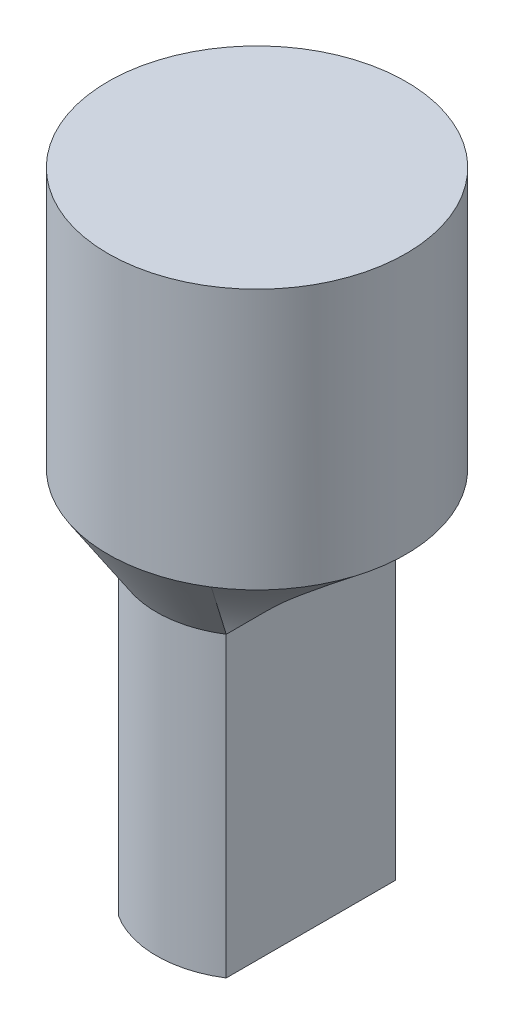
ISO-10303-21;
HEADER;
FILE_DESCRIPTION(('STEP AP214'),'2;1');
FILE_NAME('part.step','',(''),(''),'','','');
FILE_SCHEMA(('AUTOMOTIVE_DESIGN { 1 0 10303 214 1 1 1 1 }'));
ENDSEC;
DATA;
#1=APPLICATION_CONTEXT('core data for automotive mechanical design processes');
#2=APPLICATION_PROTOCOL_DEFINITION('international standard','automotive_design',2000,#1);
#3=PRODUCT_CONTEXT('',#1,'mechanical');
#4=PRODUCT('Part','Part','',(#3));
#5=PRODUCT_RELATED_PRODUCT_CATEGORY('part','',(#4));
#6=PRODUCT_DEFINITION_FORMATION('','',#4);
#7=PRODUCT_DEFINITION_CONTEXT('part definition',#1,'design');
#8=PRODUCT_DEFINITION('design','',#6,#7);
#9=PRODUCT_DEFINITION_SHAPE('','',#8);
#10=(LENGTH_UNIT() NAMED_UNIT(*) SI_UNIT(.MILLI.,.METRE.));
#11=(NAMED_UNIT(*) PLANE_ANGLE_UNIT() SI_UNIT($,.RADIAN.));
#12=(NAMED_UNIT(*) SI_UNIT($,.STERADIAN.) SOLID_ANGLE_UNIT());
#13=UNCERTAINTY_MEASURE_WITH_UNIT(LENGTH_MEASURE(1.E-05),#10,'distance_accuracy_value','');
#14=(GEOMETRIC_REPRESENTATION_CONTEXT(3) GLOBAL_UNCERTAINTY_ASSIGNED_CONTEXT((#13)) GLOBAL_UNIT_ASSIGNED_CONTEXT((#10,
#11,#12)) REPRESENTATION_CONTEXT('',''));
#15=CARTESIAN_POINT('',(0.,0.,0.));
#16=DIRECTION('',(0.,0.,1.));
#17=DIRECTION('',(1.,0.,0.));
#18=AXIS2_PLACEMENT_3D('',#15,#16,#17);
#19=CARTESIAN_POINT('',(0.,8.,0.));
#20=DIRECTION('',(0.,-1.,0.));
#21=DIRECTION('',(0.,0.,-1.));
#22=AXIS2_PLACEMENT_3D('',#19,#20,#21);
#23=CYLINDRICAL_SURFACE('',#22,2.7);
#24=CARTESIAN_POINT('',(0.,0.,0.));
#25=DIRECTION('',(0.,1.,0.));
#26=DIRECTION('',(0.,0.,1.));
#27=AXIS2_PLACEMENT_3D('',#24,#25,#26);
#28=CIRCLE('',#27,2.7);
#29=CARTESIAN_POINT('',(1.45,0.,-2.27760839478607));
#30=VERTEX_POINT('',#29);
#31=CARTESIAN_POINT('',(-1.45,0.,-2.27760839478607));
#32=VERTEX_POINT('',#31);
#33=EDGE_CURVE('E249',#30,#32,#28,.T.);
#34=ORIENTED_EDGE('',*,*,#33,.T.);
#35=DIRECTION('',(0.,-1.,0.));
#36=VECTOR('',#35,1.);
#37=CARTESIAN_POINT('',(-1.45,8.,-2.27760839478607));
#38=LINE('',#37,#36);
#39=CARTESIAN_POINT('',(-1.45,8.,-2.27760839478607));
#40=VERTEX_POINT('',#39);
#41=EDGE_CURVE('E12',#40,#32,#38,.T.);
#42=ORIENTED_EDGE('',*,*,#41,.F.);
#43=CARTESIAN_POINT('',(0.,8.,0.));
#44=DIRECTION('',(0.,1.,0.));
#45=DIRECTION('',(0.,0.,1.));
#46=AXIS2_PLACEMENT_3D('',#43,#44,#45);
#47=CIRCLE('',#46,2.7);
#48=CARTESIAN_POINT('',(1.45,8.,-2.27760839478607));
#49=VERTEX_POINT('',#48);
#50=EDGE_CURVE('E219',#49,#40,#47,.T.);
#51=ORIENTED_EDGE('',*,*,#50,.F.);
#52=DIRECTION('',(0.,-1.,0.));
#53=VECTOR('',#52,1.);
#54=CARTESIAN_POINT('',(1.45,8.,-2.27760839478607));
#55=LINE('',#54,#53);
#56=EDGE_CURVE('E91',#49,#30,#55,.T.);
#57=ORIENTED_EDGE('',*,*,#56,.T.);
#58=EDGE_LOOP('',(#34,#42,#51,#57));
#59=FACE_BOUND('',#58,.T.);
#60=ADVANCED_FACE('F71',(#59),#23,.T.);
#61=CARTESIAN_POINT('',(-1.45,8.,2.27760839478607));
#62=DIRECTION('',(1.,0.,0.));
#63=DIRECTION('',(0.,0.,-1.));
#64=AXIS2_PLACEMENT_3D('',#61,#62,#63);
#65=PLANE('',#64);
#66=DIRECTION('',(0.,0.,1.));
#67=VECTOR('',#66,1.);
#68=CARTESIAN_POINT('',(-1.45,0.,2.27760839478607));
#69=LINE('',#68,#67);
#70=CARTESIAN_POINT('',(-1.45,0.,2.27760839478607));
#71=VERTEX_POINT('',#70);
#72=EDGE_CURVE('E246',#32,#71,#69,.T.);
#73=ORIENTED_EDGE('',*,*,#72,.T.);
#74=DIRECTION('',(0.,-1.,0.));
#75=VECTOR('',#74,1.);
#76=CARTESIAN_POINT('',(-1.45,8.,2.27760839478607));
#77=LINE('',#76,#75);
#78=CARTESIAN_POINT('',(-1.45,8.,2.27760839478607));
#79=VERTEX_POINT('',#78);
#80=EDGE_CURVE('E82',#79,#71,#77,.T.);
#81=ORIENTED_EDGE('',*,*,#80,.F.);
#82=DIRECTION('',(0.,0.,-1.));
#83=VECTOR('',#82,1.);
#84=CARTESIAN_POINT('',(-1.45,8.,2.27760839478607));
#85=LINE('',#84,#83);
#86=EDGE_CURVE('E102',#40,#79,#85,.F.);
#87=ORIENTED_EDGE('',*,*,#86,.F.);
#88=ORIENTED_EDGE('',*,*,#41,.T.);
#89=EDGE_LOOP('',(#73,#81,#87,#88));
#90=FACE_BOUND('',#89,.T.);
#91=ADVANCED_FACE('F300',(#90),#65,.F.);
#92=CARTESIAN_POINT('',(0.,8.,0.));
#93=DIRECTION('',(0.,-1.,0.));
#94=DIRECTION('',(0.,0.,-1.));
#95=AXIS2_PLACEMENT_3D('',#92,#93,#94);
#96=CYLINDRICAL_SURFACE('',#95,2.7);
#97=CARTESIAN_POINT('',(0.,0.,0.));
#98=DIRECTION('',(0.,1.,0.));
#99=DIRECTION('',(0.,0.,1.));
#100=AXIS2_PLACEMENT_3D('',#97,#98,#99);
#101=CIRCLE('',#100,2.7);
#102=CARTESIAN_POINT('',(1.45,0.,2.27760839478607));
#103=VERTEX_POINT('',#102);
#104=EDGE_CURVE('E243',#71,#103,#101,.T.);
#105=ORIENTED_EDGE('',*,*,#104,.T.);
#106=DIRECTION('',(0.,-1.,0.));
#107=VECTOR('',#106,1.);
#108=CARTESIAN_POINT('',(1.45,8.,2.27760839478607));
#109=LINE('',#108,#107);
#110=CARTESIAN_POINT('',(1.45,8.,2.27760839478607));
#111=VERTEX_POINT('',#110);
#112=EDGE_CURVE('E233',#111,#103,#109,.T.);
#113=ORIENTED_EDGE('',*,*,#112,.F.);
#114=CARTESIAN_POINT('',(0.,8.,0.));
#115=DIRECTION('',(0.,1.,0.));
#116=DIRECTION('',(0.,0.,1.));
#117=AXIS2_PLACEMENT_3D('',#114,#115,#116);
#118=CIRCLE('',#117,2.7);
#119=EDGE_CURVE('E140',#79,#111,#118,.T.);
#120=ORIENTED_EDGE('',*,*,#119,.F.);
#121=ORIENTED_EDGE('',*,*,#80,.T.);
#122=EDGE_LOOP('',(#105,#113,#120,#121));
#123=FACE_BOUND('',#122,.T.);
#124=ADVANCED_FACE('F306',(#123),#96,.T.);
#125=CARTESIAN_POINT('',(1.45,8.,2.27760839478607));
#126=DIRECTION('',(-1.,0.,0.));
#127=DIRECTION('',(0.,0.,1.));
#128=AXIS2_PLACEMENT_3D('',#125,#126,#127);
#129=PLANE('',#128);
#130=DIRECTION('',(0.,0.,-1.));
#131=VECTOR('',#130,1.);
#132=CARTESIAN_POINT('',(1.45,0.,2.27760839478607));
#133=LINE('',#132,#131);
#134=EDGE_CURVE('E107',#103,#30,#133,.T.);
#135=ORIENTED_EDGE('',*,*,#134,.T.);
#136=ORIENTED_EDGE('',*,*,#56,.F.);
#137=DIRECTION('',(0.,0.,1.));
#138=VECTOR('',#137,1.);
#139=CARTESIAN_POINT('',(1.45,8.,2.27760839478607));
#140=LINE('',#139,#138);
#141=EDGE_CURVE('E228',#111,#49,#140,.F.);
#142=ORIENTED_EDGE('',*,*,#141,.F.);
#143=ORIENTED_EDGE('',*,*,#112,.T.);
#144=EDGE_LOOP('',(#135,#136,#142,#143));
#145=FACE_BOUND('',#144,.T.);
#146=ADVANCED_FACE('F311',(#145),#129,.F.);
#147=CARTESIAN_POINT('',(0.,0.,0.));
#148=DIRECTION('',(0.,1.,0.));
#149=DIRECTION('',(0.,0.,1.));
#150=AXIS2_PLACEMENT_3D('',#147,#148,#149);
#151=PLANE('',#150);
#152=ORIENTED_EDGE('',*,*,#33,.F.);
#153=ORIENTED_EDGE('',*,*,#134,.F.);
#154=ORIENTED_EDGE('',*,*,#104,.F.);
#155=ORIENTED_EDGE('',*,*,#72,.F.);
#156=EDGE_LOOP('',(#152,#153,#154,#155));
#157=FACE_BOUND('',#156,.T.);
#158=ADVANCED_FACE('F193',(#157),#151,.F.);
#159=CARTESIAN_POINT('',(0.,10.,0.));
#160=DIRECTION('',(0.,1.,0.));
#161=DIRECTION('',(0.,0.,1.));
#162=AXIS2_PLACEMENT_3D('',#159,#160,#161);
#163=CONICAL_SURFACE('',#162,4.00508586165378,0.578160792993824);
#164=DIRECTION('',(-0.293482461132192,-0.837469164067688,0.460991804963558));
#165=VECTOR('',#164,1.);
#166=CARTESIAN_POINT('',(2.15087944422148,10.,-3.37852488160803));
#167=LINE('',#166,#165);
#168=CARTESIAN_POINT('',(2.15107873782087,10.,-3.37883839321139));
#169=VERTEX_POINT('',#168);
#170=EDGE_CURVE('E153',#169,#49,#167,.T.);
#171=ORIENTED_EDGE('',*,*,#170,.T.);
#172=ORIENTED_EDGE('',*,*,#50,.T.);
#173=DIRECTION('',(0.293482461132192,-0.837469164067688,0.460991804963558));
#174=VECTOR('',#173,1.);
#175=CARTESIAN_POINT('',(-2.15087944422148,10.,-3.37852488160803));
#176=LINE('',#175,#174);
#177=CARTESIAN_POINT('',(-2.15107405581418,10.,-3.37883128092998));
#178=VERTEX_POINT('',#177);
#179=EDGE_CURVE('E145',#178,#40,#176,.T.);
#180=ORIENTED_EDGE('',*,*,#179,.F.);
#181=CARTESIAN_POINT('',(0.,10.,0.));
#182=DIRECTION('',(0.,1.,0.));
#183=DIRECTION('',(0.,0.,1.));
#184=AXIS2_PLACEMENT_3D('',#181,#182,#183);
#185=CIRCLE('',#184,4.00508586165378);
#186=EDGE_CURVE('E74',#169,#178,#185,.T.);
#187=ORIENTED_EDGE('',*,*,#186,.F.);
#188=EDGE_LOOP('',(#171,#172,#180,#187));
#189=FACE_BOUND('',#188,.T.);
#190=ADVANCED_FACE('F188',(#189),#163,.T.);
#191=CARTESIAN_POINT('',(-2.15087944422148,10.,3.37852488160803));
#192=CARTESIAN_POINT('',(-1.45,8.,2.27760839478607));
#193=CARTESIAN_POINT('',(-2.38837810571358,10.,3.22732546561014));
#194=CARTESIAN_POINT('',(-1.45,8.,2.08780769522057));
#195=CARTESIAN_POINT('',(-2.62403551444786,10.,3.04192179020373));
#196=CARTESIAN_POINT('',(-1.45,8.,1.89800699565506));
#197=CARTESIAN_POINT('',(-3.06509482090838,10.,2.59692978296305));
#198=CARTESIAN_POINT('',(-1.45,8.,1.51840559652405));
#199=CARTESIAN_POINT('',(-3.27026442145676,10.,2.3371251846785));
#200=CARTESIAN_POINT('',(-1.45,8.,1.32860489695854));
#201=CARTESIAN_POINT('',(-3.6180345114716,10.,1.75117383172113));
#202=CARTESIAN_POINT('',(-1.45,8.,0.949003497827531));
#203=CARTESIAN_POINT('',(-3.76022971850684,10.,1.42501957533599));
#204=CARTESIAN_POINT('',(-1.45,8.,0.759202798262025));
#205=CARTESIAN_POINT('',(-3.95392678960089,10.,0.732441989859377));
#206=CARTESIAN_POINT('',(-1.45,8.,0.379601399131012));
#207=CARTESIAN_POINT('',(-4.00508586165378,10.,0.366346071499664));
#208=CARTESIAN_POINT('',(-1.45,8.,0.189800699565505));
#209=CARTESIAN_POINT('',(-4.00508586165378,10.,-0.366346071499667));
#210=CARTESIAN_POINT('',(-1.45,8.,-0.189800699565507));
#211=CARTESIAN_POINT('',(-3.95392678960089,10.,-0.732441989859381));
#212=CARTESIAN_POINT('',(-1.45,8.,-0.379601399131013));
#213=CARTESIAN_POINT('',(-3.76022971850684,10.,-1.42501957533599));
#214=CARTESIAN_POINT('',(-1.45,8.,-0.759202798262025));
#215=CARTESIAN_POINT('',(-3.6180345114716,10.,-1.75117383172113));
#216=CARTESIAN_POINT('',(-1.45,8.,-0.949003497827531));
#217=CARTESIAN_POINT('',(-3.27026442145675,10.,-2.3371251846785));
#218=CARTESIAN_POINT('',(-1.45,8.,-1.32860489695854));
#219=CARTESIAN_POINT('',(-3.06509482090838,10.,-2.59692978296305));
#220=CARTESIAN_POINT('',(-1.45,8.,-1.51840559652405));
#221=CARTESIAN_POINT('',(-2.62403551444786,10.,-3.04192179020373));
#222=CARTESIAN_POINT('',(-1.45,8.,-1.89800699565506));
#223=CARTESIAN_POINT('',(-2.38837810571358,10.,-3.22732546561014));
#224=CARTESIAN_POINT('',(-1.45,8.,-2.08780769522057));
#225=CARTESIAN_POINT('',(-2.15087944422147,10.,-3.37852488160803));
#226=CARTESIAN_POINT('',(-1.45,8.,-2.27760839478607));
#227=B_SPLINE_SURFACE_WITH_KNOTS('',3,1,((#191,#192),(#193,#194),(#195,#196),(#197,#198),(#199,
#200),(#201,#202),(#203,#204),(#205,#206),(#207,#208),(#209,#210),(#211,#212),(#213,#214),(#215,
#216),(#217,#218),(#219,#220),(#221,#222),(#223,#224),(#225,#226)),.UNSPECIFIED.,.F.,.F.,.F.,(4,
2,2,2,2,2,2,2,4),(2,2),(0.,0.125,0.25,0.375,0.5,0.625,0.75,0.875,1.),(0.,1.),.UNSPECIFIED.);
#228=CARTESIAN_POINT('',(-2.15107873783228,10.,3.37883839322934));
#229=VERTEX_POINT('',#228);
#230=EDGE_CURVE('E163',#178,#229,#185,.T.);
#231=DIRECTION('',(0.293482461132192,-0.837469164067688,-0.460991804963558));
#232=VECTOR('',#231,1.);
#233=CARTESIAN_POINT('',(-2.15087944422148,10.,3.37852488160803));
#234=LINE('',#233,#232);
#235=EDGE_CURVE('E144',#229,#79,#234,.T.);
#236=ORIENTED_EDGE('',*,*,#230,.F.);
#237=ORIENTED_EDGE('',*,*,#179,.T.);
#238=ORIENTED_EDGE('',*,*,#86,.T.);
#239=ORIENTED_EDGE('',*,*,#235,.F.);
#240=EDGE_LOOP('',(#236,#237,#238,#239));
#241=FACE_BOUND('',#240,.T.);
#242=ADVANCED_FACE('F192',(#241),#227,.T.);
#243=CARTESIAN_POINT('',(2.15087944422148,10.,-3.37852488160803));
#244=CARTESIAN_POINT('',(1.45,8.,-2.27760839478607));
#245=CARTESIAN_POINT('',(2.38837810571358,10.,-3.22732546561014));
#246=CARTESIAN_POINT('',(1.45,8.,-2.08780769522057));
#247=CARTESIAN_POINT('',(2.62403551444786,10.,-3.04192179020373));
#248=CARTESIAN_POINT('',(1.45,8.,-1.89800699565506));
#249=CARTESIAN_POINT('',(3.06509482090838,10.,-2.59692978296305));
#250=CARTESIAN_POINT('',(1.45,8.,-1.51840559652405));
#251=CARTESIAN_POINT('',(3.27026442145675,10.,-2.3371251846785));
#252=CARTESIAN_POINT('',(1.45,8.,-1.32860489695854));
#253=CARTESIAN_POINT('',(3.6180345114716,10.,-1.75117383172113));
#254=CARTESIAN_POINT('',(1.45,8.,-0.94900349782753));
#255=CARTESIAN_POINT('',(3.76022971850684,10.,-1.42501957533599));
#256=CARTESIAN_POINT('',(1.45,8.,-0.759202798262023));
#257=CARTESIAN_POINT('',(3.95392678960089,10.,-0.73244198985938));
#258=CARTESIAN_POINT('',(1.45,8.,-0.379601399131011));
#259=CARTESIAN_POINT('',(4.00508586165378,10.,-0.366346071499666));
#260=CARTESIAN_POINT('',(1.45,8.,-0.189800699565505));
#261=CARTESIAN_POINT('',(4.00508586165378,10.,0.366346071499664));
#262=CARTESIAN_POINT('',(1.45,8.,0.189800699565507));
#263=CARTESIAN_POINT('',(3.95392678960089,10.,0.732441989859378));
#264=CARTESIAN_POINT('',(1.45,8.,0.379601399131013));
#265=CARTESIAN_POINT('',(3.76022971850684,10.,1.42501957533599));
#266=CARTESIAN_POINT('',(1.45,8.,0.759202798262026));
#267=CARTESIAN_POINT('',(3.6180345114716,10.,1.75117383172113));
#268=CARTESIAN_POINT('',(1.45,8.,0.949003497827532));
#269=CARTESIAN_POINT('',(3.27026442145675,10.,2.3371251846785));
#270=CARTESIAN_POINT('',(1.45,8.,1.32860489695854));
#271=CARTESIAN_POINT('',(3.06509482090838,10.,2.59692978296305));
#272=CARTESIAN_POINT('',(1.45,8.,1.51840559652405));
#273=CARTESIAN_POINT('',(2.62403551444786,10.,3.04192179020373));
#274=CARTESIAN_POINT('',(1.45,8.,1.89800699565506));
#275=CARTESIAN_POINT('',(2.38837810571358,10.,3.22732546561014));
#276=CARTESIAN_POINT('',(1.45,8.,2.08780769522057));
#277=CARTESIAN_POINT('',(2.15087944422148,10.,3.37852488160803));
#278=CARTESIAN_POINT('',(1.45,8.,2.27760839478607));
#279=B_SPLINE_SURFACE_WITH_KNOTS('',3,1,((#243,#244),(#245,#246),(#247,#248),(#249,#250),(#251,
#252),(#253,#254),(#255,#256),(#257,#258),(#259,#260),(#261,#262),(#263,#264),(#265,#266),(#267,
#268),(#269,#270),(#271,#272),(#273,#274),(#275,#276),(#277,#278)),.UNSPECIFIED.,.F.,.F.,.F.,(4,
2,2,2,2,2,2,2,4),(2,2),(0.,0.125,0.25,0.375,0.5,0.625,0.75,0.875,1.),(0.,1.),.UNSPECIFIED.);
#280=CARTESIAN_POINT('',(2.15107405578733,10.,3.37883128088772));
#281=VERTEX_POINT('',#280);
#282=EDGE_CURVE('E149',#281,#169,#185,.T.);
#283=DIRECTION('',(-0.293482461132192,-0.837469164067688,-0.460991804963558));
#284=VECTOR('',#283,1.);
#285=CARTESIAN_POINT('',(1.80043972211074,9.,2.82806663819705));
#286=LINE('',#285,#284);
#287=EDGE_CURVE('E131',#281,#111,#286,.T.);
#288=ORIENTED_EDGE('',*,*,#282,.F.);
#289=ORIENTED_EDGE('',*,*,#287,.T.);
#290=ORIENTED_EDGE('',*,*,#141,.T.);
#291=ORIENTED_EDGE('',*,*,#170,.F.);
#292=EDGE_LOOP('',(#288,#289,#290,#291));
#293=FACE_BOUND('',#292,.T.);
#294=ADVANCED_FACE('F151',(#293),#279,.T.);
#295=CARTESIAN_POINT('',(0.,10.,0.));
#296=DIRECTION('',(0.,1.,0.));
#297=DIRECTION('',(0.,0.,1.));
#298=AXIS2_PLACEMENT_3D('',#295,#296,#297);
#299=CONICAL_SURFACE('',#298,4.00508586165378,0.578160792993824);
#300=ORIENTED_EDGE('',*,*,#235,.T.);
#301=ORIENTED_EDGE('',*,*,#119,.T.);
#302=ORIENTED_EDGE('',*,*,#287,.F.);
#303=EDGE_CURVE('E136',#229,#281,#185,.T.);
#304=ORIENTED_EDGE('',*,*,#303,.F.);
#305=EDGE_LOOP('',(#300,#301,#302,#304));
#306=FACE_BOUND('',#305,.T.);
#307=ADVANCED_FACE('F134',(#306),#299,.T.);
#308=CARTESIAN_POINT('',(0.,17.,0.));
#309=DIRECTION('',(0.,-1.,0.));
#310=DIRECTION('',(0.,0.,-1.));
#311=AXIS2_PLACEMENT_3D('',#308,#309,#310);
#312=CYLINDRICAL_SURFACE('',#311,4.00508586165378);
#313=CARTESIAN_POINT('',(0.,17.,0.));
#314=DIRECTION('',(0.,1.,0.));
#315=DIRECTION('',(0.,0.,1.));
#316=AXIS2_PLACEMENT_3D('',#313,#314,#315);
#317=CIRCLE('',#316,4.00508586165378);
#318=CARTESIAN_POINT('',(0.,17.,4.00508586165378));
#319=VERTEX_POINT('',#318);
#320=EDGE_CURVE('E166',#319,#319,#317,.T.);
#321=ORIENTED_EDGE('',*,*,#320,.F.);
#322=EDGE_LOOP('',(#321));
#323=FACE_BOUND('',#322,.T.);
#324=ORIENTED_EDGE('',*,*,#282,.T.);
#325=ORIENTED_EDGE('',*,*,#186,.T.);
#326=ORIENTED_EDGE('',*,*,#230,.T.);
#327=ORIENTED_EDGE('',*,*,#303,.T.);
#328=EDGE_LOOP('',(#324,#325,#326,#327));
#329=FACE_BOUND('',#328,.T.);
#330=ADVANCED_FACE('F162',(#323,#329),#312,.T.);
#331=CARTESIAN_POINT('',(0.,17.,0.));
#332=DIRECTION('',(0.,1.,0.));
#333=DIRECTION('',(0.,0.,1.));
#334=AXIS2_PLACEMENT_3D('',#331,#332,#333);
#335=PLANE('',#334);
#336=ORIENTED_EDGE('',*,*,#320,.T.);
#337=EDGE_LOOP('',(#336));
#338=FACE_BOUND('',#337,.T.);
#339=ADVANCED_FACE('F186',(#338),#335,.T.);
#340=CLOSED_SHELL('',(#60,#91,#124,#146,#158,#190,#242,#294,#307,#330,#339));
#341=MANIFOLD_SOLID_BREP('B2',#340);
#342=ADVANCED_BREP_SHAPE_REPRESENTATION('',(#18,#341),#14);
#343=SHAPE_DEFINITION_REPRESENTATION(#9,#342);
ENDSEC;
END-ISO-10303-21;
